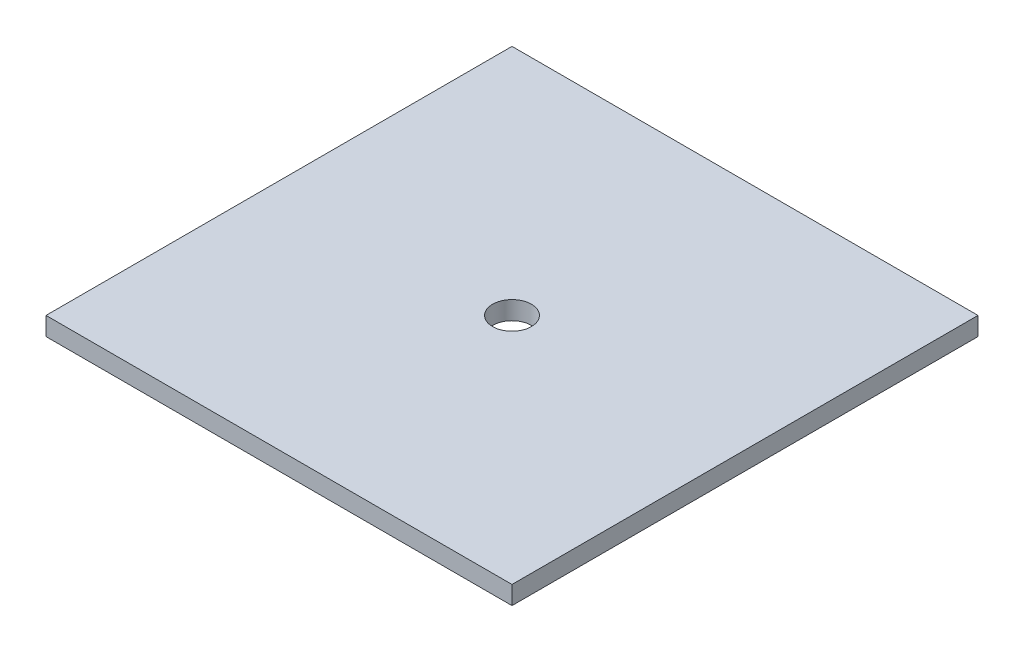
ISO-10303-21;
HEADER;
FILE_DESCRIPTION(('STEP AP214'),'2;1');
FILE_NAME('part.step','',(''),(''),'','','');
FILE_SCHEMA(('AUTOMOTIVE_DESIGN { 1 0 10303 214 1 1 1 1 }'));
ENDSEC;
DATA;
#1=APPLICATION_CONTEXT('core data for automotive mechanical design processes');
#2=APPLICATION_PROTOCOL_DEFINITION('international standard','automotive_design',2000,#1);
#3=PRODUCT_CONTEXT('',#1,'mechanical');
#4=PRODUCT('Part','Part','',(#3));
#5=PRODUCT_RELATED_PRODUCT_CATEGORY('part','',(#4));
#6=PRODUCT_DEFINITION_FORMATION('','',#4);
#7=PRODUCT_DEFINITION_CONTEXT('part definition',#1,'design');
#8=PRODUCT_DEFINITION('design','',#6,#7);
#9=PRODUCT_DEFINITION_SHAPE('','',#8);
#10=(LENGTH_UNIT() NAMED_UNIT(*) SI_UNIT(.MILLI.,.METRE.));
#11=(NAMED_UNIT(*) PLANE_ANGLE_UNIT() SI_UNIT($,.RADIAN.));
#12=(NAMED_UNIT(*) SI_UNIT($,.STERADIAN.) SOLID_ANGLE_UNIT());
#13=UNCERTAINTY_MEASURE_WITH_UNIT(LENGTH_MEASURE(1.E-05),#10,'distance_accuracy_value','');
#14=(GEOMETRIC_REPRESENTATION_CONTEXT(3) GLOBAL_UNCERTAINTY_ASSIGNED_CONTEXT((#13)) GLOBAL_UNIT_ASSIGNED_CONTEXT((#10,
#11,#12)) REPRESENTATION_CONTEXT('',''));
#15=CARTESIAN_POINT('',(0.,0.,0.));
#16=DIRECTION('',(0.,0.,1.));
#17=DIRECTION('',(1.,0.,0.));
#18=AXIS2_PLACEMENT_3D('',#15,#16,#17);
#19=CARTESIAN_POINT('',(0.,3.,38.1));
#20=DIRECTION('',(0.,0.,-1.));
#21=DIRECTION('',(-1.,0.,0.));
#22=AXIS2_PLACEMENT_3D('',#19,#20,#21);
#23=PLANE('',#22);
#24=DIRECTION('',(1.,0.,0.));
#25=VECTOR('',#24,1.);
#26=CARTESIAN_POINT('',(0.,0.,38.1));
#27=LINE('',#26,#25);
#28=CARTESIAN_POINT('',(-38.1,0.,38.1));
#29=VERTEX_POINT('',#28);
#30=CARTESIAN_POINT('',(38.1,0.,38.1));
#31=VERTEX_POINT('',#30);
#32=EDGE_CURVE('E105',#29,#31,#27,.T.);
#33=ORIENTED_EDGE('',*,*,#32,.T.);
#34=DIRECTION('',(0.,-1.,0.));
#35=VECTOR('',#34,1.);
#36=CARTESIAN_POINT('',(38.1,3.,38.1));
#37=LINE('',#36,#35);
#38=CARTESIAN_POINT('',(38.1,3.,38.1));
#39=VERTEX_POINT('',#38);
#40=EDGE_CURVE('E11',#39,#31,#37,.T.);
#41=ORIENTED_EDGE('',*,*,#40,.F.);
#42=DIRECTION('',(1.,0.,0.));
#43=VECTOR('',#42,1.);
#44=CARTESIAN_POINT('',(0.,3.,38.1));
#45=LINE('',#44,#43);
#46=CARTESIAN_POINT('',(-38.1,3.,38.1));
#47=VERTEX_POINT('',#46);
#48=EDGE_CURVE('E88',#47,#39,#45,.T.);
#49=ORIENTED_EDGE('',*,*,#48,.F.);
#50=DIRECTION('',(0.,-1.,0.));
#51=VECTOR('',#50,1.);
#52=CARTESIAN_POINT('',(-38.1,3.,38.1));
#53=LINE('',#52,#51);
#54=EDGE_CURVE('E55',#47,#29,#53,.T.);
#55=ORIENTED_EDGE('',*,*,#54,.T.);
#56=EDGE_LOOP('',(#33,#41,#49,#55));
#57=FACE_BOUND('',#56,.T.);
#58=ADVANCED_FACE('F38',(#57),#23,.F.);
#59=CARTESIAN_POINT('',(38.1,3.,0.));
#60=DIRECTION('',(-1.,0.,0.));
#61=DIRECTION('',(0.,0.,1.));
#62=AXIS2_PLACEMENT_3D('',#59,#60,#61);
#63=PLANE('',#62);
#64=DIRECTION('',(0.,0.,-1.));
#65=VECTOR('',#64,1.);
#66=CARTESIAN_POINT('',(38.1,0.,0.));
#67=LINE('',#66,#65);
#68=CARTESIAN_POINT('',(38.1,0.,-38.1));
#69=VERTEX_POINT('',#68);
#70=EDGE_CURVE('E93',#31,#69,#67,.T.);
#71=ORIENTED_EDGE('',*,*,#70,.T.);
#72=DIRECTION('',(0.,-1.,0.));
#73=VECTOR('',#72,1.);
#74=CARTESIAN_POINT('',(38.1,3.,-38.1));
#75=LINE('',#74,#73);
#76=CARTESIAN_POINT('',(38.1,3.,-38.1));
#77=VERTEX_POINT('',#76);
#78=EDGE_CURVE('E47',#77,#69,#75,.T.);
#79=ORIENTED_EDGE('',*,*,#78,.F.);
#80=DIRECTION('',(0.,0.,-1.));
#81=VECTOR('',#80,1.);
#82=CARTESIAN_POINT('',(38.1,3.,0.));
#83=LINE('',#82,#81);
#84=EDGE_CURVE('E80',#39,#77,#83,.T.);
#85=ORIENTED_EDGE('',*,*,#84,.F.);
#86=ORIENTED_EDGE('',*,*,#40,.T.);
#87=EDGE_LOOP('',(#71,#79,#85,#86));
#88=FACE_BOUND('',#87,.T.);
#89=ADVANCED_FACE('F92',(#88),#63,.F.);
#90=CARTESIAN_POINT('',(0.,3.,-38.1));
#91=DIRECTION('',(0.,0.,-1.));
#92=DIRECTION('',(-1.,0.,0.));
#93=AXIS2_PLACEMENT_3D('',#90,#91,#92);
#94=PLANE('',#93);
#95=DIRECTION('',(1.,0.,0.));
#96=VECTOR('',#95,1.);
#97=CARTESIAN_POINT('',(0.,0.,-38.1));
#98=LINE('',#97,#96);
#99=CARTESIAN_POINT('',(-38.1,0.,-38.1));
#100=VERTEX_POINT('',#99);
#101=EDGE_CURVE('E108',#100,#69,#98,.T.);
#102=ORIENTED_EDGE('',*,*,#101,.F.);
#103=DIRECTION('',(0.,-1.,0.));
#104=VECTOR('',#103,1.);
#105=CARTESIAN_POINT('',(-38.1,3.,-38.1));
#106=LINE('',#105,#104);
#107=CARTESIAN_POINT('',(-38.1,3.,-38.1));
#108=VERTEX_POINT('',#107);
#109=EDGE_CURVE('E69',#108,#100,#106,.T.);
#110=ORIENTED_EDGE('',*,*,#109,.F.);
#111=DIRECTION('',(1.,0.,0.));
#112=VECTOR('',#111,1.);
#113=CARTESIAN_POINT('',(0.,3.,-38.1));
#114=LINE('',#113,#112);
#115=EDGE_CURVE('E87',#108,#77,#114,.T.);
#116=ORIENTED_EDGE('',*,*,#115,.T.);
#117=ORIENTED_EDGE('',*,*,#78,.T.);
#118=EDGE_LOOP('',(#102,#110,#116,#117));
#119=FACE_BOUND('',#118,.T.);
#120=ADVANCED_FACE('F96',(#119),#94,.T.);
#121=CARTESIAN_POINT('',(0.,3.,0.));
#122=DIRECTION('',(0.,-1.,0.));
#123=DIRECTION('',(0.,0.,-1.));
#124=AXIS2_PLACEMENT_3D('',#121,#122,#123);
#125=CYLINDRICAL_SURFACE('',#124,3.175);
#126=CARTESIAN_POINT('',(0.,3.,0.));
#127=DIRECTION('',(0.,1.,0.));
#128=DIRECTION('',(0.,0.,1.));
#129=AXIS2_PLACEMENT_3D('',#126,#127,#128);
#130=CIRCLE('',#129,3.175);
#131=CARTESIAN_POINT('',(0.,3.,3.17499999999999));
#132=VERTEX_POINT('',#131);
#133=EDGE_CURVE('E113',#132,#132,#130,.T.);
#134=ORIENTED_EDGE('',*,*,#133,.T.);
#135=EDGE_LOOP('',(#134));
#136=FACE_BOUND('',#135,.T.);
#137=CARTESIAN_POINT('',(0.,0.,0.));
#138=DIRECTION('',(0.,1.,0.));
#139=DIRECTION('',(0.,0.,1.));
#140=AXIS2_PLACEMENT_3D('',#137,#138,#139);
#141=CIRCLE('',#140,3.175);
#142=CARTESIAN_POINT('',(0.,0.,3.17499999999999));
#143=VERTEX_POINT('',#142);
#144=EDGE_CURVE('E102',#143,#143,#141,.T.);
#145=ORIENTED_EDGE('',*,*,#144,.F.);
#146=EDGE_LOOP('',(#145));
#147=FACE_BOUND('',#146,.T.);
#148=ADVANCED_FACE('F40',(#136,#147),#125,.F.);
#149=CARTESIAN_POINT('',(-38.1,3.,0.));
#150=DIRECTION('',(-1.,0.,0.));
#151=DIRECTION('',(0.,0.,1.));
#152=AXIS2_PLACEMENT_3D('',#149,#150,#151);
#153=PLANE('',#152);
#154=DIRECTION('',(0.,0.,-1.));
#155=VECTOR('',#154,1.);
#156=CARTESIAN_POINT('',(-38.1,0.,0.));
#157=LINE('',#156,#155);
#158=EDGE_CURVE('E110',#29,#100,#157,.T.);
#159=ORIENTED_EDGE('',*,*,#158,.F.);
#160=ORIENTED_EDGE('',*,*,#54,.F.);
#161=DIRECTION('',(0.,0.,-1.));
#162=VECTOR('',#161,1.);
#163=CARTESIAN_POINT('',(-38.1,3.,0.));
#164=LINE('',#163,#162);
#165=EDGE_CURVE('E97',#47,#108,#164,.T.);
#166=ORIENTED_EDGE('',*,*,#165,.T.);
#167=ORIENTED_EDGE('',*,*,#109,.T.);
#168=EDGE_LOOP('',(#159,#160,#166,#167));
#169=FACE_BOUND('',#168,.T.);
#170=ADVANCED_FACE('F124',(#169),#153,.T.);
#171=CARTESIAN_POINT('',(0.,3.,0.));
#172=DIRECTION('',(0.,1.,0.));
#173=DIRECTION('',(0.,0.,1.));
#174=AXIS2_PLACEMENT_3D('',#171,#172,#173);
#175=PLANE('',#174);
#176=ORIENTED_EDGE('',*,*,#133,.F.);
#177=EDGE_LOOP('',(#176));
#178=FACE_BOUND('',#177,.T.);
#179=ORIENTED_EDGE('',*,*,#48,.T.);
#180=ORIENTED_EDGE('',*,*,#84,.T.);
#181=ORIENTED_EDGE('',*,*,#115,.F.);
#182=ORIENTED_EDGE('',*,*,#165,.F.);
#183=EDGE_LOOP('',(#179,#180,#181,#182));
#184=FACE_BOUND('',#183,.T.);
#185=ADVANCED_FACE('F84',(#178,#184),#175,.T.);
#186=CARTESIAN_POINT('',(0.,0.,0.));
#187=DIRECTION('',(0.,1.,0.));
#188=DIRECTION('',(0.,0.,1.));
#189=AXIS2_PLACEMENT_3D('',#186,#187,#188);
#190=PLANE('',#189);
#191=ORIENTED_EDGE('',*,*,#144,.T.);
#192=EDGE_LOOP('',(#191));
#193=FACE_BOUND('',#192,.T.);
#194=ORIENTED_EDGE('',*,*,#32,.F.);
#195=ORIENTED_EDGE('',*,*,#158,.T.);
#196=ORIENTED_EDGE('',*,*,#101,.T.);
#197=ORIENTED_EDGE('',*,*,#70,.F.);
#198=EDGE_LOOP('',(#194,#195,#196,#197));
#199=FACE_BOUND('',#198,.T.);
#200=ADVANCED_FACE('F123',(#193,#199),#190,.F.);
#201=CLOSED_SHELL('',(#58,#89,#120,#148,#170,#185,#200));
#202=MANIFOLD_SOLID_BREP('B2',#201);
#203=ADVANCED_BREP_SHAPE_REPRESENTATION('',(#18,#202),#14);
#204=SHAPE_DEFINITION_REPRESENTATION(#9,#203);
ENDSEC;
END-ISO-10303-21;
